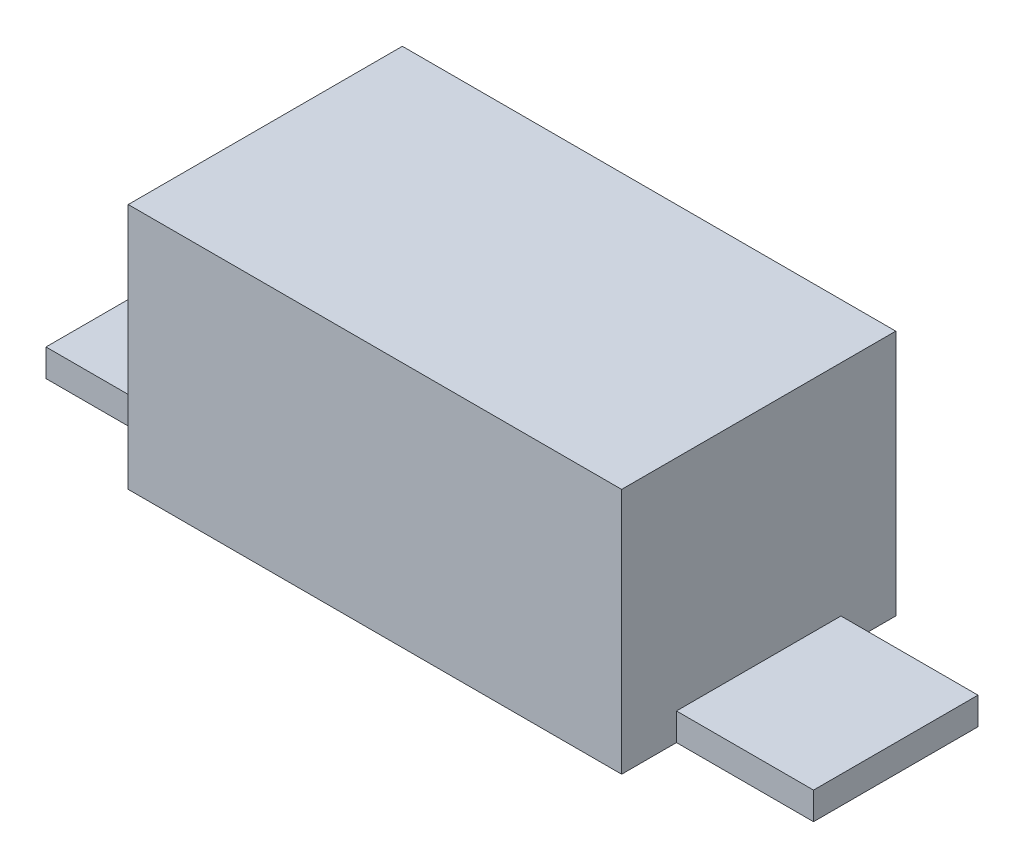
ISO-10303-21;
HEADER;
FILE_DESCRIPTION(('STEP AP214'),'2;1');
FILE_NAME('part.step','',(''),(''),'','','');
FILE_SCHEMA(('AUTOMOTIVE_DESIGN { 1 0 10303 214 1 1 1 1 }'));
ENDSEC;
DATA;
#1=APPLICATION_CONTEXT('core data for automotive mechanical design processes');
#2=APPLICATION_PROTOCOL_DEFINITION('international standard','automotive_design',2000,#1);
#3=PRODUCT_CONTEXT('',#1,'mechanical');
#4=PRODUCT('Part','Part','',(#3));
#5=PRODUCT_RELATED_PRODUCT_CATEGORY('part','',(#4));
#6=PRODUCT_DEFINITION_FORMATION('','',#4);
#7=PRODUCT_DEFINITION_CONTEXT('part definition',#1,'design');
#8=PRODUCT_DEFINITION('design','',#6,#7);
#9=PRODUCT_DEFINITION_SHAPE('','',#8);
#10=(LENGTH_UNIT() NAMED_UNIT(*) SI_UNIT(.MILLI.,.METRE.));
#11=(NAMED_UNIT(*) PLANE_ANGLE_UNIT() SI_UNIT($,.RADIAN.));
#12=(NAMED_UNIT(*) SI_UNIT($,.STERADIAN.) SOLID_ANGLE_UNIT());
#13=UNCERTAINTY_MEASURE_WITH_UNIT(LENGTH_MEASURE(1.E-05),#10,'distance_accuracy_value','');
#14=(GEOMETRIC_REPRESENTATION_CONTEXT(3) GLOBAL_UNCERTAINTY_ASSIGNED_CONTEXT((#13)) GLOBAL_UNIT_ASSIGNED_CONTEXT((#10,
#11,#12)) REPRESENTATION_CONTEXT('',''));
#15=CARTESIAN_POINT('',(0.,0.,0.));
#16=DIRECTION('',(0.,0.,1.));
#17=DIRECTION('',(1.,0.,0.));
#18=AXIS2_PLACEMENT_3D('',#15,#16,#17);
#19=CARTESIAN_POINT('',(-13.7210480930697,0.9,-8.76052404653485));
#20=DIRECTION('',(-1.,0.,0.));
#21=DIRECTION('',(0.,0.,1.));
#22=AXIS2_PLACEMENT_3D('',#19,#20,#21);
#23=PLANE('',#22);
#24=DIRECTION('',(0.,1.,0.));
#25=VECTOR('',#24,1.);
#26=CARTESIAN_POINT('',(-13.7210480930697,0.,-8.56052404653485));
#27=LINE('',#26,#25);
#28=CARTESIAN_POINT('',(-13.7210480930697,0.,-8.56052404653485));
#29=VERTEX_POINT('',#28);
#30=CARTESIAN_POINT('',(-13.7210480930697,0.1,-8.56052404653485));
#31=VERTEX_POINT('',#30);
#32=EDGE_CURVE('E55',#29,#31,#27,.T.);
#33=ORIENTED_EDGE('',*,*,#32,.F.);
#34=DIRECTION('',(0.,0.,-1.));
#35=VECTOR('',#34,1.);
#36=CARTESIAN_POINT('',(-13.7210480930697,0.,-8.76052404653485));
#37=LINE('',#36,#35);
#38=CARTESIAN_POINT('',(-13.7210480930697,0.,-8.76052404653485));
#39=VERTEX_POINT('',#38);
#40=EDGE_CURVE('E175',#29,#39,#37,.T.);
#41=ORIENTED_EDGE('',*,*,#40,.T.);
#42=DIRECTION('',(0.,-1.,0.));
#43=VECTOR('',#42,1.);
#44=CARTESIAN_POINT('',(-13.7210480930697,0.9,-8.76052404653485));
#45=LINE('',#44,#43);
#46=CARTESIAN_POINT('',(-13.7210480930697,0.9,-8.76052404653485));
#47=VERTEX_POINT('',#46);
#48=EDGE_CURVE('E188',#47,#39,#45,.T.);
#49=ORIENTED_EDGE('',*,*,#48,.F.);
#50=DIRECTION('',(0.,0.,-1.));
#51=VECTOR('',#50,1.);
#52=CARTESIAN_POINT('',(-13.7210480930697,0.9,-8.76052404653485));
#53=LINE('',#52,#51);
#54=CARTESIAN_POINT('',(-13.7210480930697,0.9,-7.76052404653485));
#55=VERTEX_POINT('',#54);
#56=EDGE_CURVE('E202',#55,#47,#53,.T.);
#57=ORIENTED_EDGE('',*,*,#56,.F.);
#58=DIRECTION('',(0.,-1.,0.));
#59=VECTOR('',#58,1.);
#60=CARTESIAN_POINT('',(-13.7210480930697,0.9,-7.76052404653485));
#61=LINE('',#60,#59);
#62=CARTESIAN_POINT('',(-13.7210480930697,0.,-7.76052404653485));
#63=VERTEX_POINT('',#62);
#64=EDGE_CURVE('E42',#55,#63,#61,.T.);
#65=ORIENTED_EDGE('',*,*,#64,.T.);
#66=CARTESIAN_POINT('',(-13.7210480930697,0.,-7.96052404653485));
#67=VERTEX_POINT('',#66);
#68=EDGE_CURVE('E171',#63,#67,#37,.T.);
#69=ORIENTED_EDGE('',*,*,#68,.T.);
#70=DIRECTION('',(0.,-1.,0.));
#71=VECTOR('',#70,1.);
#72=CARTESIAN_POINT('',(-13.7210480930697,0.,-7.96052404653485));
#73=LINE('',#72,#71);
#74=CARTESIAN_POINT('',(-13.7210480930697,0.0999999999999999,-7.96052404653485));
#75=VERTEX_POINT('',#74);
#76=EDGE_CURVE('E141',#75,#67,#73,.T.);
#77=ORIENTED_EDGE('',*,*,#76,.F.);
#78=DIRECTION('',(0.,0.,1.));
#79=VECTOR('',#78,1.);
#80=CARTESIAN_POINT('',(-13.7210480930697,0.1,-8.56052404653485));
#81=LINE('',#80,#79);
#82=EDGE_CURVE('E50',#31,#75,#81,.T.);
#83=ORIENTED_EDGE('',*,*,#82,.F.);
#84=EDGE_LOOP('',(#33,#41,#49,#57,#65,#69,#77,#83));
#85=FACE_BOUND('',#84,.T.);
#86=ADVANCED_FACE('F33',(#85),#23,.F.);
#87=CARTESIAN_POINT('',(-15.5210480930697,0.9,-8.76052404653485));
#88=DIRECTION('',(1.,0.,0.));
#89=DIRECTION('',(0.,0.,-1.));
#90=AXIS2_PLACEMENT_3D('',#87,#88,#89);
#91=PLANE('',#90);
#92=DIRECTION('',(0.,-1.,0.));
#93=VECTOR('',#92,1.);
#94=CARTESIAN_POINT('',(-15.5210480930697,0.,-8.56052404653485));
#95=LINE('',#94,#93);
#96=CARTESIAN_POINT('',(-15.5210480930697,0.1,-8.56052404653485));
#97=VERTEX_POINT('',#96);
#98=CARTESIAN_POINT('',(-15.5210480930697,0.,-8.56052404653485));
#99=VERTEX_POINT('',#98);
#100=EDGE_CURVE('E144',#97,#99,#95,.T.);
#101=ORIENTED_EDGE('',*,*,#100,.F.);
#102=DIRECTION('',(0.,0.,-1.));
#103=VECTOR('',#102,1.);
#104=CARTESIAN_POINT('',(-15.5210480930697,0.1,-8.56052404653485));
#105=LINE('',#104,#103);
#106=CARTESIAN_POINT('',(-15.5210480930697,0.1,-7.96052404653485));
#107=VERTEX_POINT('',#106);
#108=EDGE_CURVE('E157',#107,#97,#105,.T.);
#109=ORIENTED_EDGE('',*,*,#108,.F.);
#110=DIRECTION('',(0.,1.,0.));
#111=VECTOR('',#110,1.);
#112=CARTESIAN_POINT('',(-15.5210480930697,0.,-7.96052404653485));
#113=LINE('',#112,#111);
#114=CARTESIAN_POINT('',(-15.5210480930697,0.,-7.96052404653485));
#115=VERTEX_POINT('',#114);
#116=EDGE_CURVE('E147',#115,#107,#113,.T.);
#117=ORIENTED_EDGE('',*,*,#116,.F.);
#118=DIRECTION('',(0.,0.,1.));
#119=VECTOR('',#118,1.);
#120=CARTESIAN_POINT('',(-15.5210480930697,0.,-8.76052404653485));
#121=LINE('',#120,#119);
#122=CARTESIAN_POINT('',(-15.5210480930697,0.,-7.76052404653485));
#123=VERTEX_POINT('',#122);
#124=EDGE_CURVE('E196',#115,#123,#121,.T.);
#125=ORIENTED_EDGE('',*,*,#124,.T.);
#126=DIRECTION('',(0.,-1.,0.));
#127=VECTOR('',#126,1.);
#128=CARTESIAN_POINT('',(-15.5210480930697,0.9,-7.76052404653485));
#129=LINE('',#128,#127);
#130=CARTESIAN_POINT('',(-15.5210480930697,0.9,-7.76052404653485));
#131=VERTEX_POINT('',#130);
#132=EDGE_CURVE('E11',#131,#123,#129,.T.);
#133=ORIENTED_EDGE('',*,*,#132,.F.);
#134=DIRECTION('',(0.,0.,1.));
#135=VECTOR('',#134,1.);
#136=CARTESIAN_POINT('',(-15.5210480930697,0.9,-8.76052404653485));
#137=LINE('',#136,#135);
#138=CARTESIAN_POINT('',(-15.5210480930697,0.9,-8.76052404653485));
#139=VERTEX_POINT('',#138);
#140=EDGE_CURVE('E184',#139,#131,#137,.T.);
#141=ORIENTED_EDGE('',*,*,#140,.F.);
#142=DIRECTION('',(0.,-1.,0.));
#143=VECTOR('',#142,1.);
#144=CARTESIAN_POINT('',(-15.5210480930697,0.9,-8.76052404653485));
#145=LINE('',#144,#143);
#146=CARTESIAN_POINT('',(-15.5210480930697,0.,-8.76052404653485));
#147=VERTEX_POINT('',#146);
#148=EDGE_CURVE('E185',#139,#147,#145,.T.);
#149=ORIENTED_EDGE('',*,*,#148,.T.);
#150=EDGE_CURVE('E194',#147,#99,#121,.T.);
#151=ORIENTED_EDGE('',*,*,#150,.T.);
#152=EDGE_LOOP('',(#101,#109,#117,#125,#133,#141,#149,#151));
#153=FACE_BOUND('',#152,.T.);
#154=ADVANCED_FACE('F35',(#153),#91,.F.);
#155=CARTESIAN_POINT('',(-15.5210480930697,0.9,-7.76052404653485));
#156=DIRECTION('',(0.,0.,-1.));
#157=DIRECTION('',(-1.,0.,0.));
#158=AXIS2_PLACEMENT_3D('',#155,#156,#157);
#159=PLANE('',#158);
#160=DIRECTION('',(1.,0.,0.));
#161=VECTOR('',#160,1.);
#162=CARTESIAN_POINT('',(-15.5210480930697,0.,-7.76052404653485));
#163=LINE('',#162,#161);
#164=EDGE_CURVE('E180',#123,#63,#163,.T.);
#165=ORIENTED_EDGE('',*,*,#164,.T.);
#166=ORIENTED_EDGE('',*,*,#64,.F.);
#167=DIRECTION('',(1.,0.,0.));
#168=VECTOR('',#167,1.);
#169=CARTESIAN_POINT('',(-15.5210480930697,0.9,-7.76052404653485));
#170=LINE('',#169,#168);
#171=EDGE_CURVE('E204',#131,#55,#170,.T.);
#172=ORIENTED_EDGE('',*,*,#171,.F.);
#173=ORIENTED_EDGE('',*,*,#132,.T.);
#174=EDGE_LOOP('',(#165,#166,#172,#173));
#175=FACE_BOUND('',#174,.T.);
#176=ADVANCED_FACE('F245',(#175),#159,.F.);
#177=CARTESIAN_POINT('',(-15.5210480930697,0.9,-8.76052404653485));
#178=DIRECTION('',(0.,0.,1.));
#179=DIRECTION('',(1.,0.,0.));
#180=AXIS2_PLACEMENT_3D('',#177,#178,#179);
#181=PLANE('',#180);
#182=DIRECTION('',(-1.,0.,0.));
#183=VECTOR('',#182,1.);
#184=CARTESIAN_POINT('',(-15.5210480930697,0.,-8.76052404653485));
#185=LINE('',#184,#183);
#186=EDGE_CURVE('E174',#39,#147,#185,.T.);
#187=ORIENTED_EDGE('',*,*,#186,.T.);
#188=ORIENTED_EDGE('',*,*,#148,.F.);
#189=DIRECTION('',(-1.,0.,0.));
#190=VECTOR('',#189,1.);
#191=CARTESIAN_POINT('',(-15.5210480930697,0.9,-8.76052404653485));
#192=LINE('',#191,#190);
#193=EDGE_CURVE('E189',#47,#139,#192,.T.);
#194=ORIENTED_EDGE('',*,*,#193,.F.);
#195=ORIENTED_EDGE('',*,*,#48,.T.);
#196=EDGE_LOOP('',(#187,#188,#194,#195));
#197=FACE_BOUND('',#196,.T.);
#198=ADVANCED_FACE('F253',(#197),#181,.F.);
#199=CARTESIAN_POINT('',(0.,0.9,0.));
#200=DIRECTION('',(0.,1.,0.));
#201=DIRECTION('',(0.,0.,1.));
#202=AXIS2_PLACEMENT_3D('',#199,#200,#201);
#203=PLANE('',#202);
#204=ORIENTED_EDGE('',*,*,#140,.T.);
#205=ORIENTED_EDGE('',*,*,#171,.T.);
#206=ORIENTED_EDGE('',*,*,#56,.T.);
#207=ORIENTED_EDGE('',*,*,#193,.T.);
#208=EDGE_LOOP('',(#204,#205,#206,#207));
#209=FACE_BOUND('',#208,.T.);
#210=ADVANCED_FACE('F248',(#209),#203,.T.);
#211=CARTESIAN_POINT('',(0.,0.,0.));
#212=DIRECTION('',(0.,1.,0.));
#213=DIRECTION('',(0.,0.,1.));
#214=AXIS2_PLACEMENT_3D('',#211,#212,#213);
#215=PLANE('',#214);
#216=ORIENTED_EDGE('',*,*,#150,.F.);
#217=ORIENTED_EDGE('',*,*,#186,.F.);
#218=ORIENTED_EDGE('',*,*,#40,.F.);
#219=DIRECTION('',(-1.,0.,0.));
#220=VECTOR('',#219,1.);
#221=CARTESIAN_POINT('',(-13.2210480930697,0.,-8.56052404653485));
#222=LINE('',#221,#220);
#223=CARTESIAN_POINT('',(-13.2210480930697,0.,-8.56052404653485));
#224=VERTEX_POINT('',#223);
#225=EDGE_CURVE('E260',#224,#29,#222,.T.);
#226=ORIENTED_EDGE('',*,*,#225,.F.);
#227=DIRECTION('',(0.,0.,-1.));
#228=VECTOR('',#227,1.);
#229=CARTESIAN_POINT('',(-13.2210480930697,0.,-8.56052404653485));
#230=LINE('',#229,#228);
#231=CARTESIAN_POINT('',(-13.2210480930697,0.,-7.96052404653485));
#232=VERTEX_POINT('',#231);
#233=EDGE_CURVE('E137',#232,#224,#230,.T.);
#234=ORIENTED_EDGE('',*,*,#233,.F.);
#235=DIRECTION('',(-1.,0.,0.));
#236=VECTOR('',#235,1.);
#237=CARTESIAN_POINT('',(-13.2210480930697,0.,-7.96052404653485));
#238=LINE('',#237,#236);
#239=EDGE_CURVE('E149',#232,#67,#238,.T.);
#240=ORIENTED_EDGE('',*,*,#239,.T.);
#241=ORIENTED_EDGE('',*,*,#68,.F.);
#242=ORIENTED_EDGE('',*,*,#164,.F.);
#243=ORIENTED_EDGE('',*,*,#124,.F.);
#244=DIRECTION('',(1.,0.,0.));
#245=VECTOR('',#244,1.);
#246=CARTESIAN_POINT('',(-16.0210480930697,0.,-7.96052404653485));
#247=LINE('',#246,#245);
#248=CARTESIAN_POINT('',(-16.0210480930697,0.,-7.96052404653485));
#249=VERTEX_POINT('',#248);
#250=EDGE_CURVE('E210',#249,#115,#247,.T.);
#251=ORIENTED_EDGE('',*,*,#250,.F.);
#252=DIRECTION('',(0.,0.,1.));
#253=VECTOR('',#252,1.);
#254=CARTESIAN_POINT('',(-16.0210480930697,0.,-8.56052404653485));
#255=LINE('',#254,#253);
#256=CARTESIAN_POINT('',(-16.0210480930697,0.,-8.56052404653485));
#257=VERTEX_POINT('',#256);
#258=EDGE_CURVE('E156',#257,#249,#255,.T.);
#259=ORIENTED_EDGE('',*,*,#258,.F.);
#260=DIRECTION('',(1.,0.,0.));
#261=VECTOR('',#260,1.);
#262=CARTESIAN_POINT('',(-16.0210480930697,0.,-8.56052404653485));
#263=LINE('',#262,#261);
#264=EDGE_CURVE('E230',#257,#99,#263,.T.);
#265=ORIENTED_EDGE('',*,*,#264,.T.);
#266=EDGE_LOOP('',(#216,#217,#218,#226,#234,#240,#241,#242,#243,#251,#259,#265));
#267=FACE_BOUND('',#266,.T.);
#268=ADVANCED_FACE('F241',(#267),#215,.F.);
#269=CARTESIAN_POINT('',(-16.0210480930697,0.,-8.56052404653485));
#270=DIRECTION('',(0.,0.,1.));
#271=DIRECTION('',(1.,0.,0.));
#272=AXIS2_PLACEMENT_3D('',#269,#270,#271);
#273=PLANE('',#272);
#274=ORIENTED_EDGE('',*,*,#100,.T.);
#275=ORIENTED_EDGE('',*,*,#264,.F.);
#276=DIRECTION('',(0.,-1.,0.));
#277=VECTOR('',#276,1.);
#278=CARTESIAN_POINT('',(-16.0210480930697,0.,-8.56052404653485));
#279=LINE('',#278,#277);
#280=CARTESIAN_POINT('',(-16.0210480930697,0.1,-8.56052404653485));
#281=VERTEX_POINT('',#280);
#282=EDGE_CURVE('E153',#281,#257,#279,.T.);
#283=ORIENTED_EDGE('',*,*,#282,.F.);
#284=DIRECTION('',(1.,0.,0.));
#285=VECTOR('',#284,1.);
#286=CARTESIAN_POINT('',(-16.0210480930697,0.1,-8.56052404653485));
#287=LINE('',#286,#285);
#288=EDGE_CURVE('E163',#281,#97,#287,.T.);
#289=ORIENTED_EDGE('',*,*,#288,.T.);
#290=EDGE_LOOP('',(#274,#275,#283,#289));
#291=FACE_BOUND('',#290,.T.);
#292=ADVANCED_FACE('F215',(#291),#273,.F.);
#293=CARTESIAN_POINT('',(-16.0210480930697,0.,-7.96052404653485));
#294=DIRECTION('',(0.,0.,-1.));
#295=DIRECTION('',(-1.,0.,0.));
#296=AXIS2_PLACEMENT_3D('',#293,#294,#295);
#297=PLANE('',#296);
#298=ORIENTED_EDGE('',*,*,#116,.T.);
#299=DIRECTION('',(1.,0.,0.));
#300=VECTOR('',#299,1.);
#301=CARTESIAN_POINT('',(-16.0210480930697,0.1,-7.96052404653485));
#302=LINE('',#301,#300);
#303=CARTESIAN_POINT('',(-16.0210480930697,0.1,-7.96052404653485));
#304=VERTEX_POINT('',#303);
#305=EDGE_CURVE('E208',#304,#107,#302,.T.);
#306=ORIENTED_EDGE('',*,*,#305,.F.);
#307=DIRECTION('',(0.,1.,0.));
#308=VECTOR('',#307,1.);
#309=CARTESIAN_POINT('',(-16.0210480930697,0.,-7.96052404653485));
#310=LINE('',#309,#308);
#311=EDGE_CURVE('E159',#249,#304,#310,.T.);
#312=ORIENTED_EDGE('',*,*,#311,.F.);
#313=ORIENTED_EDGE('',*,*,#250,.T.);
#314=EDGE_LOOP('',(#298,#306,#312,#313));
#315=FACE_BOUND('',#314,.T.);
#316=ADVANCED_FACE('F299',(#315),#297,.F.);
#317=CARTESIAN_POINT('',(-16.0210480930697,0.1,-8.56052404653485));
#318=DIRECTION('',(0.,-1.,0.));
#319=DIRECTION('',(0.,0.,-1.));
#320=AXIS2_PLACEMENT_3D('',#317,#318,#319);
#321=PLANE('',#320);
#322=ORIENTED_EDGE('',*,*,#108,.T.);
#323=ORIENTED_EDGE('',*,*,#288,.F.);
#324=DIRECTION('',(0.,0.,-1.));
#325=VECTOR('',#324,1.);
#326=CARTESIAN_POINT('',(-16.0210480930697,0.1,-8.56052404653485));
#327=LINE('',#326,#325);
#328=EDGE_CURVE('E161',#304,#281,#327,.T.);
#329=ORIENTED_EDGE('',*,*,#328,.F.);
#330=ORIENTED_EDGE('',*,*,#305,.T.);
#331=EDGE_LOOP('',(#322,#323,#329,#330));
#332=FACE_BOUND('',#331,.T.);
#333=ADVANCED_FACE('F220',(#332),#321,.F.);
#334=CARTESIAN_POINT('',(-16.0210480930697,0.,0.));
#335=DIRECTION('',(1.,0.,0.));
#336=DIRECTION('',(0.,0.,-1.));
#337=AXIS2_PLACEMENT_3D('',#334,#335,#336);
#338=PLANE('',#337);
#339=ORIENTED_EDGE('',*,*,#282,.T.);
#340=ORIENTED_EDGE('',*,*,#258,.T.);
#341=ORIENTED_EDGE('',*,*,#311,.T.);
#342=ORIENTED_EDGE('',*,*,#328,.T.);
#343=EDGE_LOOP('',(#339,#340,#341,#342));
#344=FACE_BOUND('',#343,.T.);
#345=ADVANCED_FACE('F304',(#344),#338,.F.);
#346=CARTESIAN_POINT('',(-13.2210480930697,0.,-8.56052404653485));
#347=DIRECTION('',(0.,0.,1.));
#348=DIRECTION('',(1.,0.,0.));
#349=AXIS2_PLACEMENT_3D('',#346,#347,#348);
#350=PLANE('',#349);
#351=ORIENTED_EDGE('',*,*,#32,.T.);
#352=DIRECTION('',(-1.,0.,0.));
#353=VECTOR('',#352,1.);
#354=CARTESIAN_POINT('',(-13.2210480930697,0.1,-8.56052404653485));
#355=LINE('',#354,#353);
#356=CARTESIAN_POINT('',(-13.2210480930697,0.1,-8.56052404653485));
#357=VERTEX_POINT('',#356);
#358=EDGE_CURVE('E126',#357,#31,#355,.T.);
#359=ORIENTED_EDGE('',*,*,#358,.F.);
#360=DIRECTION('',(0.,1.,0.));
#361=VECTOR('',#360,1.);
#362=CARTESIAN_POINT('',(-13.2210480930697,0.,-8.56052404653485));
#363=LINE('',#362,#361);
#364=EDGE_CURVE('E132',#224,#357,#363,.T.);
#365=ORIENTED_EDGE('',*,*,#364,.F.);
#366=ORIENTED_EDGE('',*,*,#225,.T.);
#367=EDGE_LOOP('',(#351,#359,#365,#366));
#368=FACE_BOUND('',#367,.T.);
#369=ADVANCED_FACE('F143',(#368),#350,.F.);
#370=CARTESIAN_POINT('',(-13.2210480930697,0.1,-8.56052404653485));
#371=DIRECTION('',(0.,-1.,0.));
#372=DIRECTION('',(0.,0.,-1.));
#373=AXIS2_PLACEMENT_3D('',#370,#371,#372);
#374=PLANE('',#373);
#375=ORIENTED_EDGE('',*,*,#82,.T.);
#376=DIRECTION('',(-1.,0.,0.));
#377=VECTOR('',#376,1.);
#378=CARTESIAN_POINT('',(-13.2210480930697,0.0999999999999999,-7.96052404653485));
#379=LINE('',#378,#377);
#380=CARTESIAN_POINT('',(-13.2210480930697,0.0999999999999999,-7.96052404653485));
#381=VERTEX_POINT('',#380);
#382=EDGE_CURVE('E128',#381,#75,#379,.T.);
#383=ORIENTED_EDGE('',*,*,#382,.F.);
#384=DIRECTION('',(0.,0.,1.));
#385=VECTOR('',#384,1.);
#386=CARTESIAN_POINT('',(-13.2210480930697,0.1,-8.56052404653485));
#387=LINE('',#386,#385);
#388=EDGE_CURVE('E122',#357,#381,#387,.T.);
#389=ORIENTED_EDGE('',*,*,#388,.F.);
#390=ORIENTED_EDGE('',*,*,#358,.T.);
#391=EDGE_LOOP('',(#375,#383,#389,#390));
#392=FACE_BOUND('',#391,.T.);
#393=ADVANCED_FACE('F124',(#392),#374,.F.);
#394=CARTESIAN_POINT('',(-13.2210480930697,0.,-7.96052404653485));
#395=DIRECTION('',(0.,0.,-1.));
#396=DIRECTION('',(-1.,0.,0.));
#397=AXIS2_PLACEMENT_3D('',#394,#395,#396);
#398=PLANE('',#397);
#399=ORIENTED_EDGE('',*,*,#76,.T.);
#400=ORIENTED_EDGE('',*,*,#239,.F.);
#401=DIRECTION('',(0.,-1.,0.));
#402=VECTOR('',#401,1.);
#403=CARTESIAN_POINT('',(-13.2210480930697,0.,-7.96052404653485));
#404=LINE('',#403,#402);
#405=EDGE_CURVE('E131',#381,#232,#404,.T.);
#406=ORIENTED_EDGE('',*,*,#405,.F.);
#407=ORIENTED_EDGE('',*,*,#382,.T.);
#408=EDGE_LOOP('',(#399,#400,#406,#407));
#409=FACE_BOUND('',#408,.T.);
#410=ADVANCED_FACE('F258',(#409),#398,.F.);
#411=CARTESIAN_POINT('',(-13.2210480930697,0.,0.));
#412=DIRECTION('',(1.,0.,0.));
#413=DIRECTION('',(0.,0.,-1.));
#414=AXIS2_PLACEMENT_3D('',#411,#412,#413);
#415=PLANE('',#414);
#416=ORIENTED_EDGE('',*,*,#364,.T.);
#417=ORIENTED_EDGE('',*,*,#388,.T.);
#418=ORIENTED_EDGE('',*,*,#405,.T.);
#419=ORIENTED_EDGE('',*,*,#233,.T.);
#420=EDGE_LOOP('',(#416,#417,#418,#419));
#421=FACE_BOUND('',#420,.T.);
#422=ADVANCED_FACE('F135',(#421),#415,.T.);
#423=CLOSED_SHELL('',(#86,#154,#176,#198,#210,#268,#292,#316,#333,#345,#369,#393,#410,#422));
#424=MANIFOLD_SOLID_BREP('B2',#423);
#425=ADVANCED_BREP_SHAPE_REPRESENTATION('',(#18,#424),#14);
#426=SHAPE_DEFINITION_REPRESENTATION(#9,#425);
ENDSEC;
END-ISO-10303-21;
